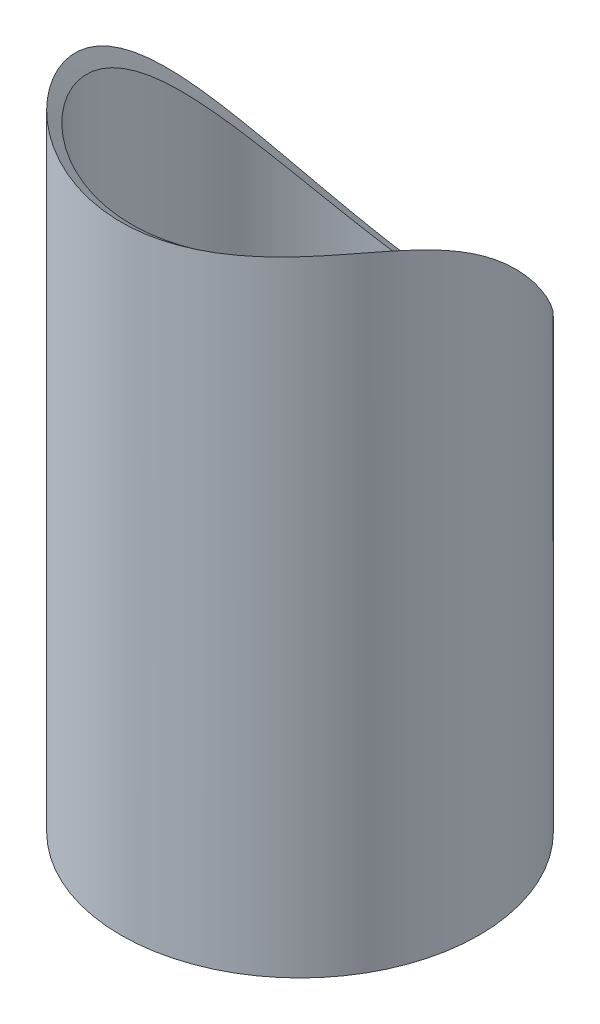
ISO-10303-21;
HEADER;
FILE_DESCRIPTION(('STEP AP214'),'2;1');
FILE_NAME('part.step','',(''),(''),'','','');
FILE_SCHEMA(('AUTOMOTIVE_DESIGN { 1 0 10303 214 1 1 1 1 }'));
ENDSEC;
DATA;
#1=APPLICATION_CONTEXT('core data for automotive mechanical design processes');
#2=APPLICATION_PROTOCOL_DEFINITION('international standard','automotive_design',2000,#1);
#3=PRODUCT_CONTEXT('',#1,'mechanical');
#4=PRODUCT('Part','Part','',(#3));
#5=PRODUCT_RELATED_PRODUCT_CATEGORY('part','',(#4));
#6=PRODUCT_DEFINITION_FORMATION('','',#4);
#7=PRODUCT_DEFINITION_CONTEXT('part definition',#1,'design');
#8=PRODUCT_DEFINITION('design','',#6,#7);
#9=PRODUCT_DEFINITION_SHAPE('','',#8);
#10=(LENGTH_UNIT() NAMED_UNIT(*) SI_UNIT(.MILLI.,.METRE.));
#11=(NAMED_UNIT(*) PLANE_ANGLE_UNIT() SI_UNIT($,.RADIAN.));
#12=(NAMED_UNIT(*) SI_UNIT($,.STERADIAN.) SOLID_ANGLE_UNIT());
#13=UNCERTAINTY_MEASURE_WITH_UNIT(LENGTH_MEASURE(1.E-05),#10,'distance_accuracy_value','');
#14=(GEOMETRIC_REPRESENTATION_CONTEXT(3) GLOBAL_UNCERTAINTY_ASSIGNED_CONTEXT((#13)) GLOBAL_UNIT_ASSIGNED_CONTEXT((#10,
#11,#12)) REPRESENTATION_CONTEXT('',''));
#15=CARTESIAN_POINT('',(0.,0.,0.));
#16=DIRECTION('',(0.,0.,1.));
#17=DIRECTION('',(1.,0.,0.));
#18=AXIS2_PLACEMENT_3D('',#15,#16,#17);
#19=CARTESIAN_POINT('',(0.,0.,0.));
#20=DIRECTION('',(0.,1.,0.));
#21=DIRECTION('',(0.,0.,1.));
#22=AXIS2_PLACEMENT_3D('',#19,#20,#21);
#23=PLANE('',#22);
#24=CARTESIAN_POINT('',(0.,0.,0.));
#25=DIRECTION('',(0.,1.,0.));
#26=DIRECTION('',(0.,0.,1.));
#27=AXIS2_PLACEMENT_3D('',#24,#25,#26);
#28=CIRCLE('',#27,50.);
#29=CARTESIAN_POINT('',(0.,0.,50.0000000000001));
#30=VERTEX_POINT('',#29);
#31=EDGE_CURVE('E57',#30,#30,#28,.T.);
#32=ORIENTED_EDGE('',*,*,#31,.F.);
#33=EDGE_LOOP('',(#32));
#34=FACE_BOUND('',#33,.T.);
#35=CARTESIAN_POINT('',(0.,0.,0.));
#36=DIRECTION('',(0.,1.,0.));
#37=DIRECTION('',(1.,0.,0.));
#38=AXIS2_PLACEMENT_3D('',#35,#36,#37);
#39=CIRCLE('',#38,47.);
#40=CARTESIAN_POINT('',(47.0000000000001,0.,0.));
#41=VERTEX_POINT('',#40);
#42=EDGE_CURVE('E95',#41,#41,#39,.T.);
#43=ORIENTED_EDGE('',*,*,#42,.T.);
#44=EDGE_LOOP('',(#43));
#45=FACE_BOUND('',#44,.T.);
#46=ADVANCED_FACE('F76',(#34,#45),#23,.F.);
#47=CARTESIAN_POINT('',(0.,200.,0.));
#48=DIRECTION('',(0.,-1.,0.));
#49=DIRECTION('',(0.,0.,-1.));
#50=AXIS2_PLACEMENT_3D('',#47,#48,#49);
#51=CYLINDRICAL_SURFACE('',#50,50.);
#52=CARTESIAN_POINT('',(0.,102.326764325178,-50.0000000000001));
#53=CARTESIAN_POINT('',(0.795231155165547,102.32677633696,-49.9999928787591));
#54=CARTESIAN_POINT('',(1.59062664740446,102.357285401247,-49.9809805065112));
#55=CARTESIAN_POINT('',(3.17509377698037,102.478526510149,-49.9053944857018));
#56=CARTESIAN_POINT('',(3.96416372914793,102.569274096255,-49.8488111438596));
#57=CARTESIAN_POINT('',(5.53094144987887,102.808752545755,-49.6993831062527));
#58=CARTESIAN_POINT('',(6.30863396108135,102.957554973607,-49.6064936555319));
#59=CARTESIAN_POINT('',(7.84660876704109,103.309487730468,-49.3865823818624));
#60=CARTESIAN_POINT('',(8.60689011712004,103.512620999763,-49.2595587116304));
#61=CARTESIAN_POINT('',(10.2815428124195,104.02215291929,-48.9405371118884));
#62=CARTESIAN_POINT('',(11.1903846974882,104.341591126601,-48.7402917111025));
#63=CARTESIAN_POINT('',(12.9708214013539,105.047351563788,-48.2970007091835));
#64=CARTESIAN_POINT('',(13.8424065368081,105.43369105166,-48.053944064094));
#65=CARTESIAN_POINT('',(15.5467915762851,106.264684071611,-47.5299198244585));
#66=CARTESIAN_POINT('',(16.3795386988642,106.709413997505,-47.2489025508337));
#67=CARTESIAN_POINT('',(18.0041648696057,107.648305602229,-46.6540309972718));
#68=CARTESIAN_POINT('',(18.7960418735396,108.142469750019,-46.340175077194));
#69=CARTESIAN_POINT('',(20.7677829514783,109.458698303409,-45.501649028043));
#70=CARTESIAN_POINT('',(21.919228276627,110.310607167608,-44.9566058883097));
#71=CARTESIAN_POINT('',(23.5765934213247,111.646779830402,-44.0968453281826));
#72=CARTESIAN_POINT('',(24.1176187572306,112.102084345064,-43.8030988439031));
#73=CARTESIAN_POINT('',(25.177318223479,113.029901569076,-43.2027008942595));
#74=CARTESIAN_POINT('',(25.6959930544053,113.502413738187,-42.8960498339899));
#75=CARTESIAN_POINT('',(27.2218195699025,114.94447192996,-41.957145216769));
#76=CARTESIAN_POINT('',(28.1966260524319,115.936786323278,-41.3070662507145));
#77=CARTESIAN_POINT('',(30.0664148778809,117.967413745257,-39.9666568189324));
#78=CARTESIAN_POINT('',(30.9614058678657,119.005721772765,-39.2763307269387));
#79=CARTESIAN_POINT('',(32.5740142389004,120.989604558241,-37.9458729029163));
#80=CARTESIAN_POINT('',(33.2999797052826,121.931155673256,-37.3098060413672));
#81=CARTESIAN_POINT('',(34.69922714535,123.835759963002,-36.012140657693));
#82=CARTESIAN_POINT('',(35.3725009746669,124.798816432289,-35.3505382121241));
#83=CARTESIAN_POINT('',(36.6699436922086,126.741947232314,-34.0028046544777));
#84=CARTESIAN_POINT('',(37.2940772664785,127.722033194655,-33.3166564087092));
#85=CARTESIAN_POINT('',(38.4953909678007,129.694153525858,-31.9210359536882));
#86=CARTESIAN_POINT('',(39.0725733819641,130.686187310006,-31.2115648829171));
#87=CARTESIAN_POINT('',(40.1830772753761,132.679918021028,-29.7682829433362));
#88=CARTESIAN_POINT('',(40.7163279130805,133.681627753495,-29.0344353402156));
#89=CARTESIAN_POINT('',(41.7396262545141,135.689519614184,-27.5430833603442));
#90=CARTESIAN_POINT('',(42.2296729119428,136.695701850101,-26.7855784112684));
#91=CARTESIAN_POINT('',(43.1674484874484,138.708439461785,-25.2464468894299));
#92=CARTESIAN_POINT('',(43.6151979628074,139.714994415101,-24.4648322820382));
#93=CARTESIAN_POINT('',(44.4692134460975,141.725291651118,-22.8758105816072));
#94=CARTESIAN_POINT('',(44.8754814982419,142.729034070047,-22.0684047621411));
#95=CARTESIAN_POINT('',(45.5446928036897,144.465621442298,-20.6428307366727));
#96=CARTESIAN_POINT('',(45.8171541224691,145.200010398197,-20.0309914857546));
#97=CARTESIAN_POINT('',(46.339336152854,146.663448151003,-18.7914414639263));
#98=CARTESIAN_POINT('',(46.5890575242723,147.392497102288,-18.1637311541998));
#99=CARTESIAN_POINT('',(47.0653454721909,148.843539226763,-16.8912656279326));
#100=CARTESIAN_POINT('',(47.2919073909733,149.565530954338,-16.2465070154086));
#101=CARTESIAN_POINT('',(47.7210962862374,151.000209169178,-14.9388923284498));
#102=CARTESIAN_POINT('',(47.9237232864017,151.712895665651,-14.2760362719225));
#103=CARTESIAN_POINT('',(48.3035237207669,153.124694942434,-12.9327295362779));
#104=CARTESIAN_POINT('',(48.4807634527253,153.823838796169,-12.2523303706063));
#105=CARTESIAN_POINT('',(48.8091000387039,155.207802863047,-10.8708714367499));
#106=CARTESIAN_POINT('',(48.9601960268989,155.892622601145,-10.1698109852071));
#107=CARTESIAN_POINT('',(49.2344703373963,157.244482642277,-8.74598922789924));
#108=CARTESIAN_POINT('',(49.3576614510455,157.911530967333,-8.02323803774285));
#109=CARTESIAN_POINT('',(49.5740759585511,159.224476061468,-6.5545304176125));
#110=CARTESIAN_POINT('',(49.6673030237895,159.870375413135,-5.80857684283274));
#111=CARTESIAN_POINT('',(49.8396341887173,161.288224356092,-4.11123355974497));
#112=CARTESIAN_POINT('',(49.9100583751243,162.053469929062,-3.15330098845998));
#113=CARTESIAN_POINT('',(49.9951932324974,163.536383035215,-1.19879061156345));
#114=CARTESIAN_POINT('',(50.0099092154992,164.254055098341,-0.202216499757603));
#115=CARTESIAN_POINT('',(49.9768777580651,165.631013016188,1.82777261081202));
#116=CARTESIAN_POINT('',(49.9292148120533,166.290376561223,2.8611359342287));
#117=CARTESIAN_POINT('',(49.7642206761808,167.541587434349,4.96311614926866));
#118=CARTESIAN_POINT('',(49.6468911641185,168.133436388003,6.03173219130596));
#119=CARTESIAN_POINT('',(49.4124398271782,168.966932397926,7.66277501663472));
#120=CARTESIAN_POINT('',(49.3237719932608,169.237300708217,8.21483943637373));
#121=CARTESIAN_POINT('',(49.125980334383,169.757298998625,9.32500852954369));
#122=CARTESIAN_POINT('',(49.0168591647474,170.006931664653,9.88311241005818));
#123=CARTESIAN_POINT('',(48.7774489557032,170.484703003667,11.0040439127056));
#124=CARTESIAN_POINT('',(48.6471573591776,170.712839074874,11.5668720976762));
#125=CARTESIAN_POINT('',(48.3648861932602,171.147041609233,12.6955145490505));
#126=CARTESIAN_POINT('',(48.2129095137941,171.353111006768,13.2613284078989));
#127=CARTESIAN_POINT('',(47.8868702660726,171.742993469456,14.394273669452));
#128=CARTESIAN_POINT('',(47.712807337788,171.926806171706,14.9614050934864));
#129=CARTESIAN_POINT('',(47.3424164031711,172.272246267686,16.0950666887334));
#130=CARTESIAN_POINT('',(47.1460911204623,172.433876369945,16.6615969249551));
#131=CARTESIAN_POINT('',(46.7311176956745,172.735390360532,17.7922804314379));
#132=CARTESIAN_POINT('',(46.5124691732735,172.87527387826,18.3564336610314));
#133=CARTESIAN_POINT('',(46.0530183548814,173.133988262764,19.4804599570112));
#134=CARTESIAN_POINT('',(45.8122167572984,173.252819792891,20.0403331577295));
#135=CARTESIAN_POINT('',(45.1319003112059,173.546755458374,21.5451308063664));
#136=CARTESIAN_POINT('',(44.6715447791912,173.702811807283,22.4844879241793));
#137=CARTESIAN_POINT('',(43.6895655333759,173.962608745892,24.3376669192286));
#138=CARTESIAN_POINT('',(43.1679495334114,174.066355913603,25.2514919935257));
#139=CARTESIAN_POINT('',(42.0658145362634,174.228672016122,27.0476998050581));
#140=CARTESIAN_POINT('',(41.4852630613762,174.287215886048,27.9300648396908));
#141=CARTESIAN_POINT('',(40.2685698289489,174.366365033067,29.6573539929146));
#142=CARTESIAN_POINT('',(39.6324231512833,174.386966948762,30.5022747877315));
#143=CARTESIAN_POINT('',(38.2404225425919,174.39794152718,32.2339302399166));
#144=CARTESIAN_POINT('',(37.4789732436936,174.385029417829,33.1161883623898));
#145=CARTESIAN_POINT('',(35.8968445456659,174.330829945527,34.8248843680712));
#146=CARTESIAN_POINT('',(35.0761628752375,174.289541493951,35.6513201083836));
#147=CARTESIAN_POINT('',(33.3796192239417,174.186633412423,37.2445364080527));
#148=CARTESIAN_POINT('',(32.5037423656168,174.125008281742,38.0113007578779));
#149=CARTESIAN_POINT('',(30.7012771460594,173.988537554293,39.4814441190573));
#150=CARTESIAN_POINT('',(29.7746854841053,173.913691096322,40.1848189968684));
#151=CARTESIAN_POINT('',(27.7174840096004,173.743981708956,41.6362511413775));
#152=CARTESIAN_POINT('',(26.5785269064127,173.647857888089,42.3723679939896));
#153=CARTESIAN_POINT('',(24.2446099578016,173.454451367353,43.7496893394174));
#154=CARTESIAN_POINT('',(23.0496447963525,173.357168558134,44.3908847986167));
#155=CARTESIAN_POINT('',(20.6108493553185,173.168351919196,45.574448806399));
#156=CARTESIAN_POINT('',(19.3670053780831,173.076819719957,46.116789408631));
#157=CARTESIAN_POINT('',(16.8386756599534,172.905185539877,47.0988136874802));
#158=CARTESIAN_POINT('',(15.5541901292302,172.825083499938,47.5384978948696));
#159=CARTESIAN_POINT('',(12.9036286498392,172.678031821191,48.3267991100747));
#160=CARTESIAN_POINT('',(11.5363043108704,172.61169429424,48.6713423159362));
#161=CARTESIAN_POINT('',(8.77657624304018,172.499815244604,49.2438601993345));
#162=CARTESIAN_POINT('',(7.38417167584608,172.454274418415,49.4718309728033));
#163=CARTESIAN_POINT('',(4.58463832873363,172.386398094693,49.8093232666276));
#164=CARTESIAN_POINT('',(3.17751092931003,172.364060440851,49.9188557936798));
#165=CARTESIAN_POINT('',(0.358880196481982,172.343732413806,50.0185943329277));
#166=CARTESIAN_POINT('',(-1.05262303552267,172.345741480578,50.0088030898156));
#167=CARTESIAN_POINT('',(-3.84228389314267,172.373727087043,49.8713281888586));
#168=CARTESIAN_POINT('',(-5.22055915882626,172.399240125042,49.7459243925797));
#169=CARTESIAN_POINT('',(-7.96138216213194,172.472311477161,49.3814503482581));
#170=CARTESIAN_POINT('',(-9.32393007826777,172.519869540806,49.1423813916772));
#171=CARTESIAN_POINT('',(-12.0236705153588,172.634601058165,48.5524493259306));
#172=CARTESIAN_POINT('',(-13.3608645677455,172.701773323092,48.2015929919167));
#173=CARTESIAN_POINT('',(-16.0007609696298,172.852114937226,47.3907442836715));
#174=CARTESIAN_POINT('',(-17.3034629976696,172.935284435464,46.9307508927049));
#175=CARTESIAN_POINT('',(-19.8705660999988,173.113138088304,45.902926088806));
#176=CARTESIAN_POINT('',(-21.1348086579538,173.20786347393,45.3347042203529));
#177=CARTESIAN_POINT('',(-22.9920272829026,173.353689911021,44.4054780828261));
#178=CARTESIAN_POINT('',(-23.6046555078712,173.402928638987,44.0828720462419));
#179=CARTESIAN_POINT('',(-24.8159558913726,173.501732597096,43.4125243569897));
#180=CARTESIAN_POINT('',(-25.4146293109076,173.551297797214,43.0647849871885));
#181=CARTESIAN_POINT('',(-26.5975886347781,173.649803471989,42.3444017837804));
#182=CARTESIAN_POINT('',(-27.1818609680714,173.698743337901,41.9717356022974));
#183=CARTESIAN_POINT('',(-28.3344636034067,173.794844685042,41.2024052473812));
#184=CARTESIAN_POINT('',(-28.9027953762306,173.84200633048,40.8057432986885));
#185=CARTESIAN_POINT('',(-30.0226946658046,173.933353792515,39.9889757324013));
#186=CARTESIAN_POINT('',(-30.5742604402669,173.977539300415,39.5688676911151));
#187=CARTESIAN_POINT('',(-31.6595949431079,174.061607629836,38.7059510191568));
#188=CARTESIAN_POINT('',(-32.1933653658236,174.101490861799,38.2631445599));
#189=CARTESIAN_POINT('',(-33.2518961782275,174.176208422139,37.3471583337301));
#190=CARTESIAN_POINT('',(-33.7763106097951,174.21093647062,36.8735698799831));
#191=CARTESIAN_POINT('',(-34.8047817554685,174.272808379176,35.9044059780572));
#192=CARTESIAN_POINT('',(-35.3088406091013,174.299953038107,35.4088328521863));
#193=CARTESIAN_POINT('',(-36.2958160778749,174.344900467194,34.3964186749262));
#194=CARTESIAN_POINT('',(-36.7787277458474,174.36270106199,33.8795727012519));
#195=CARTESIAN_POINT('',(-37.722263419494,174.387053758934,32.8257667806158));
#196=CARTESIAN_POINT('',(-38.1828901259328,174.393607227481,32.2888092850793));
#197=CARTESIAN_POINT('',(-39.0803226919571,174.393457837485,31.1965901867506));
#198=CARTESIAN_POINT('',(-39.5171610575036,174.386773559976,30.6413553145509));
#199=CARTESIAN_POINT('',(-40.366692512381,174.358087220851,29.5131951270633));
#200=CARTESIAN_POINT('',(-40.7793888000701,174.33608719328,28.9402721705386));
#201=CARTESIAN_POINT('',(-41.5796612544318,174.274609458222,27.7782157693444));
#202=CARTESIAN_POINT('',(-41.9672432163685,174.235135799452,27.1890861094775));
#203=CARTESIAN_POINT('',(-42.7164205646865,174.136540845563,25.9962228450816));
#204=CARTESIAN_POINT('',(-43.0780180015605,174.077421102832,25.3924903979251));
#205=CARTESIAN_POINT('',(-43.9522494819807,173.90160292504,23.8605359325979));
#206=CARTESIAN_POINT('',(-44.4477462534691,173.77091784817,22.9240081605286));
#207=CARTESIAN_POINT('',(-45.374858801486,173.452995311705,21.0293719268922));
#208=CARTESIAN_POINT('',(-45.8064857755141,173.265767782542,20.0712672821476));
#209=CARTESIAN_POINT('',(-46.6038022344418,172.829624860387,18.1431105362585));
#210=CARTESIAN_POINT('',(-46.9695730483401,172.580786468783,17.1730747739823));
#211=CARTESIAN_POINT('',(-47.6353387402114,172.018088005333,15.2292502272579));
#212=CARTESIAN_POINT('',(-47.9353321218687,171.704226454645,14.255461357946));
#213=CARTESIAN_POINT('',(-48.4704217217579,171.011093365382,12.3138936561125));
#214=CARTESIAN_POINT('',(-48.7055458285062,170.631850049953,11.3461124162716));
#215=CARTESIAN_POINT('',(-49.1135740969927,169.81004094153,9.42453458847521));
#216=CARTESIAN_POINT('',(-49.2864788233127,169.367475723171,8.47073787369876));
#217=CARTESIAN_POINT('',(-49.573942522184,168.423089179288,6.58306870710715));
#218=CARTESIAN_POINT('',(-49.6884526260244,167.921218654086,5.64921356787106));
#219=CARTESIAN_POINT('',(-49.8634636212367,166.86439579225,3.80678831466837));
#220=CARTESIAN_POINT('',(-49.9239571104165,166.309436192061,2.8982216826467));
#221=CARTESIAN_POINT('',(-49.98677750252,165.29717322138,1.33199084717485));
#222=CARTESIAN_POINT('',(-49.9998346462937,164.849945049938,0.668165427963807));
#223=CARTESIAN_POINT('',(-50.0001622473646,163.932128207913,-0.643240073326549));
#224=CARTESIAN_POINT('',(-49.9874297122739,163.461536832668,-1.29081826140609));
#225=CARTESIAN_POINT('',(-49.9380204239182,162.499583373847,-2.56980543051292));
#226=CARTESIAN_POINT('',(-49.9013331534714,162.008212255713,-3.20120718277495));
#227=CARTESIAN_POINT('',(-49.8057029587799,161.007461938352,-4.44777639092029));
#228=CARTESIAN_POINT('',(-49.7467606138933,160.498083208224,-5.06294426896816));
#229=CARTESIAN_POINT('',(-49.6078758132233,159.461775079119,-6.27972849487964));
#230=CARTESIAN_POINT('',(-49.5278578943181,158.934788676919,-6.88128753645319));
#231=CARTESIAN_POINT('',(-49.3482489907749,157.867175547263,-8.06914681336612));
#232=CARTESIAN_POINT('',(-49.2486580693051,157.326548863833,-8.65544709794332));
#233=CARTESIAN_POINT('',(-49.0310520534146,156.233652718399,-9.81340717667192));
#234=CARTESIAN_POINT('',(-48.9130397034549,155.681385001283,-10.3850691369261));
#235=CARTESIAN_POINT('',(-48.6595223074266,154.566819285827,-11.5145916508858));
#236=CARTESIAN_POINT('',(-48.5240162163466,154.00452069001,-12.0724513777228));
#237=CARTESIAN_POINT('',(-48.1231372608155,152.425720033898,-13.60885183241));
#238=CARTESIAN_POINT('',(-47.8394601436417,151.399888766341,-14.5730975994245));
#239=CARTESIAN_POINT('',(-47.2221365200103,149.328590133262,-16.4638616548736));
#240=CARTESIAN_POINT('',(-46.8884819257695,148.283119613542,-17.3903738060084));
#241=CARTESIAN_POINT('',(-46.1729559179919,146.177990311412,-19.2097462339311));
#242=CARTESIAN_POINT('',(-45.7910466632967,145.118320983767,-20.1025793783501));
#243=CARTESIAN_POINT('',(-44.9802290442567,142.99099231313,-21.8566330361099));
#244=CARTESIAN_POINT('',(-44.5513233405235,141.923333425636,-22.7178553353551));
#245=CARTESIAN_POINT('',(-43.6467451663616,139.785056620734,-24.4106998281441));
#246=CARTESIAN_POINT('',(-43.1710890607193,138.714439865356,-25.242332241647));
#247=CARTESIAN_POINT('',(-42.172182067216,136.574224274878,-26.877971606135));
#248=CARTESIAN_POINT('',(-41.6489293555677,135.504625480372,-27.6819774969107));
#249=CARTESIAN_POINT('',(-40.5538371840858,133.371537319219,-29.2627779568747));
#250=CARTESIAN_POINT('',(-39.9820317100248,132.308044226421,-30.0395910311825));
#251=CARTESIAN_POINT('',(-38.7874932663433,130.190900242364,-31.5669178374915));
#252=CARTESIAN_POINT('',(-38.1647654072002,129.137248375254,-32.3174341978102));
#253=CARTESIAN_POINT('',(-37.1282304602445,127.467568476189,-33.4938332007558));
#254=CARTESIAN_POINT('',(-36.7317239054006,126.846805187669,-33.9283089734325));
#255=CARTESIAN_POINT('',(-35.9189533366179,125.611586953204,-34.787621466831));
#256=CARTESIAN_POINT('',(-35.5026900626861,124.99713177203,-35.2124585476999));
#257=CARTESIAN_POINT('',(-34.6495810521913,123.775675600363,-36.0522512141031));
#258=CARTESIAN_POINT('',(-34.2127333273996,123.1686753371,-36.4672058392509));
#259=CARTESIAN_POINT('',(-33.3176199822008,121.963531263882,-37.2867864722234));
#260=CARTESIAN_POINT('',(-32.8593542600833,121.365387496003,-37.6914124309849));
#261=CARTESIAN_POINT('',(-31.9211903416042,120.180398631533,-38.4891693601176));
#262=CARTESIAN_POINT('',(-31.4413272373452,119.593537270581,-38.8823173800537));
#263=CARTESIAN_POINT('',(-30.4582624410577,118.431836329354,-39.6571045534335));
#264=CARTESIAN_POINT('',(-29.9550603171393,117.856996971833,-40.0387434936852));
#265=CARTESIAN_POINT('',(-28.924358556779,116.721434824388,-40.7895562106594));
#266=CARTESIAN_POINT('',(-28.3968656901363,116.160708167847,-41.1587334113375));
#267=CARTESIAN_POINT('',(-27.3163521672273,115.055486686675,-41.8836494782841));
#268=CARTESIAN_POINT('',(-26.7633333801391,114.510990678319,-42.2393893250676));
#269=CARTESIAN_POINT('',(-25.4148423793767,113.236930001679,-43.0688883121915));
#270=CARTESIAN_POINT('',(-24.6072123992593,112.515816971234,-43.5360243871797));
#271=CARTESIAN_POINT('',(-22.9377948318521,111.117194641079,-44.4382462116946));
#272=CARTESIAN_POINT('',(-22.0760051378585,110.439687039609,-44.8733307130478));
#273=CARTESIAN_POINT('',(-20.2964474090199,109.138659952919,-45.7057798253795));
#274=CARTESIAN_POINT('',(-19.378731984444,108.515091023262,-46.1031790145738));
#275=CARTESIAN_POINT('',(-17.4851643310513,107.33315690987,-46.854086161689));
#276=CARTESIAN_POINT('',(-16.5093341189616,106.774767267372,-47.2076105869422));
#277=CARTESIAN_POINT('',(-14.7741077037759,105.878516286701,-47.7735945303338));
#278=CARTESIAN_POINT('',(-14.0282729115991,105.522045697428,-47.9982300325357));
#279=CARTESIAN_POINT('',(-12.5071753215116,104.85666613146,-48.4168620800481));
#280=CARTESIAN_POINT('',(-11.7319130097551,104.547756369467,-48.6108591312447));
#281=CARTESIAN_POINT('',(-10.1560188616791,103.984178599971,-48.9643346478429));
#282=CARTESIAN_POINT('',(-9.35544144486637,103.729402266588,-49.1238820606676));
#283=CARTESIAN_POINT('',(-7.73138938111397,103.279253136121,-49.4055054990377));
#284=CARTESIAN_POINT('',(-6.90792335706151,103.083858290469,-49.527595432846));
#285=CARTESIAN_POINT('',(-5.57815954723944,102.823134493333,-49.6904005743257));
#286=CARTESIAN_POINT('',(-5.07740644515955,102.737093362188,-49.7440996153112));
#287=CARTESIAN_POINT('',(-4.07102878410686,102.588914175645,-49.8365517829117));
#288=CARTESIAN_POINT('',(-3.56540485018245,102.526773094082,-49.8753068017033));
#289=CARTESIAN_POINT('',(-2.55064599876585,102.427052581275,-49.9374875788808));
#290=CARTESIAN_POINT('',(-2.0415101066305,102.389480270344,-49.9609088933838));
#291=CARTESIAN_POINT('',(-1.02160531716856,102.339333366434,-49.9921667165177));
#292=CARTESIAN_POINT('',(-0.510836565066337,102.326756609111,-50.0000045745069));
#293=CARTESIAN_POINT('',(0.,102.326764325178,-50.0000000000001));
#294=B_SPLINE_CURVE_WITH_KNOTS('',3,(#52,#53,#54,#55,#56,#57,#58,#59,#60,#61,#62,#63,#64,#65,
#66,#67,#68,#69,#70,#71,#72,#73,#74,#75,#76,#77,#78,#79,#80,#81,#82,#83,#84,#85,#86,#87,#88,#89,
#90,#91,#92,#93,#94,#95,#96,#97,#98,#99,#100,#101,#102,#103,#104,#105,#106,#107,#108,#109,#110,
#111,#112,#113,#114,#115,#116,#117,#118,#119,#120,#121,#122,#123,#124,#125,#126,#127,#128,#129,
#130,#131,#132,#133,#134,#135,#136,#137,#138,#139,#140,#141,#142,#143,#144,#145,#146,#147,#148,
#149,#150,#151,#152,#153,#154,#155,#156,#157,#158,#159,#160,#161,#162,#163,#164,#165,#166,#167,
#168,#169,#170,#171,#172,#173,#174,#175,#176,#177,#178,#179,#180,#181,#182,#183,#184,#185,#186,
#187,#188,#189,#190,#191,#192,#193,#194,#195,#196,#197,#198,#199,#200,#201,#202,#203,#204,#205,
#206,#207,#208,#209,#210,#211,#212,#213,#214,#215,#216,#217,#218,#219,#220,#221,#222,#223,#224,
#225,#226,#227,#228,#229,#230,#231,#232,#233,#234,#235,#236,#237,#238,#239,#240,#241,#242,#243,
#244,#245,#246,#247,#248,#249,#250,#251,#252,#253,#254,#255,#256,#257,#258,#259,#260,#261,#262,
#263,#264,#265,#266,#267,#268,#269,#270,#271,#272,#273,#274,#275,#276,#277,#278,#279,#280,#281,
#282,#283,#284,#285,#286,#287,#288,#289,#290,#291,#292,#293),.UNSPECIFIED.,.T.,.F.,(4,2,2,2,2,2,
2,2,2,2,2,2,2,2,2,2,2,2,2,2,2,2,2,2,2,2,2,2,2,2,2,2,2,2,2,2,2,2,2,2,2,2,2,2,2,2,2,2,2,2,2,2,2,2,
2,2,2,2,2,2,2,2,2,2,2,2,2,2,2,2,2,2,2,2,2,2,2,2,2,2,2,2,2,2,2,2,2,2,2,2,2,2,2,2,2,2,2,2,2,2,2,2,
2,2,2,2,2,2,2,2,2,2,2,2,2,2,2,2,2,2,4),(0.,2.385176745267,4.77096910349289,7.15971177824463,
9.54858375353366,12.4959368401175,15.4440513677781,18.396062162927,21.3482204680009,
25.9378259433407,28.2344818925331,30.5310657998622,35.133185024043,39.734805055766,
43.7783976177814,47.8226139548896,51.8697105757607,55.9166099340021,59.9699122857253,
64.0233127720963,68.0747329778494,72.1259534323048,75.1074000424644,78.0887601166179,
81.0707186127504,84.0526741583326,87.0266946462897,90.0008136086141,92.9735664898199,
95.9459549918344,99.6276953811212,103.309084690535,106.985492587704,110.661811948552,
112.524446891445,114.386840187726,116.24945860478,118.111829026004,119.974229809725,
121.836402988737,123.698607898974,125.560754120581,128.729967010606,131.898781264595,
135.069351342433,138.240202297569,141.733286840393,145.226505398765,148.720669589645,
152.215061465711,156.28906866998,160.363463346346,164.43900807707,168.514531735222,
172.744215860831,176.974041631362,181.203474282157,185.432809647481,189.580486984593,
193.728117196982,197.87549607973,202.022913601522,206.185587307117,208.267482772205,
210.349189375287,212.432787996572,214.516193734547,216.599815240667,218.683237790442,
220.80495605091,222.926450719008,225.048439066354,227.170169597607,229.288924092978,
231.407397255722,233.525379815744,235.643195057426,238.842207995796,242.04065942473,
245.235133423875,248.429680083894,251.622851200712,254.815993341804,258.011803360544,
261.208051251418,263.608727704348,266.009682724785,268.411692579444,270.813639907765,
273.224307402002,275.634967116396,278.04526802809,280.455712988936,284.762386724555,
289.069758157458,293.380528629813,297.691055182339,302.000078190524,306.309266379698,
310.615462720662,314.921227428765,317.486506999003,320.051690559943,322.617122398982,
325.182566422062,327.743982749298,330.305446494607,332.86620063336,335.42676755318,
338.962054315287,342.497478678146,346.029627066651,349.560445713436,352.128241657727,
354.695995199471,357.258561006362,359.8201741572,361.352234904962,362.884101603072,
364.416412057378,365.948589824451),.UNSPECIFIED.);
#295=CARTESIAN_POINT('',(0.,102.326764325178,-50.0000000000001));
#296=VERTEX_POINT('',#295);
#297=EDGE_CURVE('E96',#296,#296,#294,.T.);
#298=ORIENTED_EDGE('',*,*,#297,.T.);
#299=EDGE_LOOP('',(#298));
#300=FACE_BOUND('',#299,.T.);
#301=ORIENTED_EDGE('',*,*,#31,.T.);
#302=EDGE_LOOP('',(#301));
#303=FACE_BOUND('',#302,.T.);
#304=ADVANCED_FACE('F85',(#300,#303),#51,.T.);
#305=CARTESIAN_POINT('',(0.,200.,0.));
#306=DIRECTION('',(0.,-1.,0.));
#307=DIRECTION('',(0.,0.,-1.));
#308=AXIS2_PLACEMENT_3D('',#305,#306,#307);
#309=CYLINDRICAL_SURFACE('',#308,47.);
#310=CARTESIAN_POINT('',(0.,104.427386939807,-47.0000000000001));
#311=CARTESIAN_POINT('',(0.764792902859943,104.427392685347,-46.9999965009565));
#312=CARTESIAN_POINT('',(1.52964339276103,104.45639633879,-46.9812902262954));
#313=CARTESIAN_POINT('',(3.05320093226238,104.571635561351,-46.9069280863851));
#314=CARTESIAN_POINT('',(3.81190749873358,104.657875587871,-46.8512693433858));
#315=CARTESIAN_POINT('',(5.31812092431187,104.885422497186,-46.7042894514722));
#316=CARTESIAN_POINT('',(6.06561785253409,105.026775521517,-46.6129384202348));
#317=CARTESIAN_POINT('',(7.54396694678241,105.361101959395,-46.3966266881497));
#318=CARTESIAN_POINT('',(8.27481745911254,105.554080477484,-46.271662663764));
#319=CARTESIAN_POINT('',(9.88369485467062,106.037866373272,-45.957928293162));
#320=CARTESIAN_POINT('',(10.7564525504906,106.340986450916,-45.7610786372378));
#321=CARTESIAN_POINT('',(12.4662664543503,107.010686072943,-45.3251734668508));
#322=CARTESIAN_POINT('',(13.3033139215014,107.377281044423,-45.0861076917956));
#323=CARTESIAN_POINT('',(14.940234047461,108.165845138693,-44.5704704261143));
#324=CARTESIAN_POINT('',(15.7400538391005,108.587889940926,-44.2938476591371));
#325=CARTESIAN_POINT('',(17.3004031237414,109.478909025231,-43.7080171149257));
#326=CARTESIAN_POINT('',(18.060930438666,109.947885904639,-43.3988075342077));
#327=CARTESIAN_POINT('',(19.9460566881046,111.191479882506,-42.5759701102063));
#328=CARTESIAN_POINT('',(21.0439568704176,111.993716570801,-42.0425556591562));
#329=CARTESIAN_POINT('',(22.6243074974842,113.251606160844,-41.2006936030432));
#330=CARTESIAN_POINT('',(23.1401985128735,113.680171972977,-40.91299420979));
#331=CARTESIAN_POINT('',(24.1506468229442,114.553386746644,-40.3247799315056));
#332=CARTESIAN_POINT('',(24.6452047676412,114.998035217381,-40.0242654375043));
#333=CARTESIAN_POINT('',(26.1000096379779,116.354907517845,-39.1038283453312));
#334=CARTESIAN_POINT('',(27.029319416481,117.288391198473,-38.4661254211318));
#335=CARTESIAN_POINT('',(28.8112652229256,119.198126599717,-37.1502028893981));
#336=CARTESIAN_POINT('',(29.6639085279146,120.174374248142,-36.4719871374627));
#337=CARTESIAN_POINT('',(31.1783468392513,122.01358059264,-35.18165902026));
#338=CARTESIAN_POINT('',(31.8497758965268,122.872109000437,-34.5744758361696));
#339=CARTESIAN_POINT('',(33.1443674109587,124.607759160059,-33.3354743609177));
#340=CARTESIAN_POINT('',(33.7675229843574,125.484883541022,-32.7036525755545));
#341=CARTESIAN_POINT('',(34.9685116258367,127.253685221566,-31.4162160015381));
#342=CARTESIAN_POINT('',(35.546314152246,128.145371847674,-30.7605856069746));
#343=CARTESIAN_POINT('',(36.6582986553527,129.938742001813,-29.4265715721833));
#344=CARTESIAN_POINT('',(37.1924825919382,130.840425078611,-28.748188956202));
#345=CARTESIAN_POINT('',(38.2196801311811,132.651497187732,-27.3678133498236));
#346=CARTESIAN_POINT('',(38.7126357715276,133.560895152998,-26.6657890027888));
#347=CARTESIAN_POINT('',(39.657801718316,135.382799253987,-25.2386860225017));
#348=CARTESIAN_POINT('',(40.1100110511485,136.29530546344,-24.5136068389272));
#349=CARTESIAN_POINT('',(40.9742129350447,138.119650679162,-23.0400325666484));
#350=CARTESIAN_POINT('',(41.3862241269943,139.031489798201,-22.2915485460401));
#351=CARTESIAN_POINT('',(42.1704842065015,140.851507322299,-20.7697623079918));
#352=CARTESIAN_POINT('',(42.5427351325707,141.759685912735,-19.9964613655633));
#353=CARTESIAN_POINT('',(43.1575054081512,143.338588691382,-18.6237014837565));
#354=CARTESIAN_POINT('',(43.4089333042018,144.010932027524,-18.0300769160702));
#355=CARTESIAN_POINT('',(43.889122832343,145.34995311302,-16.8274817302065));
#356=CARTESIAN_POINT('',(44.1178851768566,146.016631039845,-16.2185115951257));
#357=CARTESIAN_POINT('',(44.552205070926,147.342674830655,-14.9842942957195));
#358=CARTESIAN_POINT('',(44.75775872917,148.002039451782,-14.3590444233956));
#359=CARTESIAN_POINT('',(45.1447953732143,149.311384620637,-13.0914704327697));
#360=CARTESIAN_POINT('',(45.3262783624974,149.961365169722,-12.4491463169382));
#361=CARTESIAN_POINT('',(45.6636310571111,151.248020613644,-11.1482346192558));
#362=CARTESIAN_POINT('',(45.8195682152736,151.88472654413,-10.4896953270826));
#363=CARTESIAN_POINT('',(46.1050477699275,153.144195855815,-9.15375080579962));
#364=CARTESIAN_POINT('',(46.2345894046393,153.766958834157,-8.47634503284085));
#365=CARTESIAN_POINT('',(46.4655309749075,154.995517796929,-7.10209140040597));
#366=CARTESIAN_POINT('',(46.5669426136735,155.601320742818,-6.40525175939839));
#367=CARTESIAN_POINT('',(46.7396474281144,156.793048311251,-4.99125010683065));
#368=CARTESIAN_POINT('',(46.8109439605019,157.378975142543,-4.27409036971805));
#369=CARTESIAN_POINT('',(46.9375514278286,158.699559472805,-2.60103940200201));
#370=CARTESIAN_POINT('',(46.9816924625653,159.426249156408,-1.63793491445718));
#371=CARTESIAN_POINT('',(47.0091146424172,160.83200716839,0.323332371703793));
#372=CARTESIAN_POINT('',(46.9924024726618,161.511080719364,1.32149130742498));
#373=CARTESIAN_POINT('',(46.8914632697768,162.811968486558,3.34967074306967));
#374=CARTESIAN_POINT('',(46.8073180236633,163.43385104961,4.37965119379913));
#375=CARTESIAN_POINT('',(46.5646512370937,164.612546063977,6.46817607724186));
#376=CARTESIAN_POINT('',(46.4061311238008,165.169359763628,7.52671996149023));
#377=CARTESIAN_POINT('',(46.1068677028641,165.952859580362,9.13560104399427));
#378=CARTESIAN_POINT('',(45.9960647738612,166.206686681376,9.67852426174442));
#379=CARTESIAN_POINT('',(45.7532088855046,166.695046181602,10.7682550206222));
#380=CARTESIAN_POINT('',(45.6211585849127,166.929580989389,11.3150620675795));
#381=CARTESIAN_POINT('',(45.3352328482557,167.378846899069,12.4111862129466));
#382=CARTESIAN_POINT('',(45.1813545430091,167.593575391389,12.960503632131));
#383=CARTESIAN_POINT('',(44.8514037954011,168.002876536226,14.059903951587));
#384=CARTESIAN_POINT('',(44.6753341853732,168.197451755193,14.6099867453265));
#385=CARTESIAN_POINT('',(44.3007103230053,168.566464920599,15.7093718173194));
#386=CARTESIAN_POINT('',(44.1021520755381,168.740899277844,16.2586739392801));
#387=CARTESIAN_POINT('',(43.682526637281,169.069792693572,17.3545702256242));
#388=CARTESIAN_POINT('',(43.4614621016613,169.224254103486,17.9011647014808));
#389=CARTESIAN_POINT('',(42.9968784218998,169.51370355134,18.9899636888321));
#390=CARTESIAN_POINT('',(42.7533590054118,169.648691353042,19.5321681469951));
#391=CARTESIAN_POINT('',(42.2441340452842,169.89989362139,20.6104049529778));
#392=CARTESIAN_POINT('',(41.9784291307717,170.016108620114,21.1464374753285));
#393=CARTESIAN_POINT('',(41.2230388321405,170.309035489841,22.5994973142711));
#394=CARTESIAN_POINT('',(40.7114856107469,170.467949970636,23.5088919204682));
#395=CARTESIAN_POINT('',(39.6255908896088,170.737965645589,25.2963756153959));
#396=CARTESIAN_POINT('',(39.051256510212,170.849072254851,26.1744682393029));
#397=CARTESIAN_POINT('',(37.842672327756,171.030179384511,27.8933013463009));
#398=CARTESIAN_POINT('',(37.2083994716918,171.100164013628,28.7340272734551));
#399=CARTESIAN_POINT('',(35.883660886259,171.205808133949,30.372238999076));
#400=CARTESIAN_POINT('',(35.1931906338095,171.241464859282,31.16972130843));
#401=CARTESIAN_POINT('',(33.6982367582638,171.287021421322,32.7832254859124));
#402=CARTESIAN_POINT('',(32.8890538866014,171.294448077693,33.594964496438));
#403=CARTESIAN_POINT('',(31.2136626722372,171.284733498374,35.1570662357067));
#404=CARTESIAN_POINT('',(30.3474524205991,171.267591439872,35.9074269079821));
#405=CARTESIAN_POINT('',(28.5626520261964,171.215966259092,37.3428262938722));
#406=CARTESIAN_POINT('',(27.6440485805528,171.18147871518,38.027848298645));
#407=CARTESIAN_POINT('',(25.7595945188753,171.101549461382,39.32879914507));
#408=CARTESIAN_POINT('',(24.7937413586196,171.056107161104,39.9447242602173));
#409=CARTESIAN_POINT('',(22.6961758561978,170.953795588432,41.1769635937964));
#410=CARTESIAN_POINT('',(21.5588386327343,170.896207968438,41.783670052583));
#411=CARTESIAN_POINT('',(19.2381399650142,170.780891387106,42.9016683321019));
#412=CARTESIAN_POINT('',(18.0547750539911,170.72316241543,43.4129529488602));
#413=CARTESIAN_POINT('',(15.6495867152172,170.613002318301,44.3367820809419));
#414=CARTESIAN_POINT('',(14.4277558741367,170.560572222371,44.7493074294768));
#415=CARTESIAN_POINT('',(11.95399588489,170.465314121003,45.4726587102874));
#416=CARTESIAN_POINT('',(10.702066938756,170.422486051132,45.7834853250072));
#417=CARTESIAN_POINT('',(8.14458341892098,170.348685752443,46.307799961075));
#418=CARTESIAN_POINT('',(6.83847321075925,170.318040523684,46.5186293144084));
#419=CARTESIAN_POINT('',(4.21283153706305,170.272419898178,46.8294754514244));
#420=CARTESIAN_POINT('',(2.89329975963491,170.257444866423,46.929489653993));
#421=CARTESIAN_POINT('',(0.25049520727098,170.244217870285,47.0179241114492));
#422=CARTESIAN_POINT('',(-1.07277733474594,170.245964886675,47.0063511677058));
#423=CARTESIAN_POINT('',(-3.71349493180928,170.266058600342,46.8717165467007));
#424=CARTESIAN_POINT('',(-5.03094005890814,170.284405091796,46.7486562518061));
#425=CARTESIAN_POINT('',(-7.63663896327127,170.336124797444,46.39388309069));
#426=CARTESIAN_POINT('',(-8.92505407202246,170.369337463302,46.1633300212513));
#427=CARTESIAN_POINT('',(-11.4777958933981,170.44834362594,45.5957224656188));
#428=CARTESIAN_POINT('',(-12.7421227276429,170.494137059182,45.2586685172931));
#429=CARTESIAN_POINT('',(-15.2380772186748,170.594758413651,44.4804445326069));
#430=CARTESIAN_POINT('',(-16.469701843909,170.649587169096,44.0392648808371));
#431=CARTESIAN_POINT('',(-18.8917024188293,170.763525410824,43.0559191913866));
#432=CARTESIAN_POINT('',(-20.0820779129254,170.822634944366,42.5137520387363));
#433=CARTESIAN_POINT('',(-22.4231307707345,170.939630963588,41.3272125017861));
#434=CARTESIAN_POINT('',(-23.5734112106347,170.997503765359,40.6820521584709));
#435=CARTESIAN_POINT('',(-25.2551203249155,171.077353013212,39.6435813794351));
#436=CARTESIAN_POINT('',(-25.8084812867702,171.102812600633,39.2855794429374));
#437=CARTESIAN_POINT('',(-26.8997471969061,171.150323686413,38.5465646245941));
#438=CARTESIAN_POINT('',(-27.4376536508627,171.1723755177,38.1655539956961));
#439=CARTESIAN_POINT('',(-28.4974122817231,171.211924877704,37.3809111722657));
#440=CARTESIAN_POINT('',(-29.0192537503372,171.229419424295,36.9772643742871));
#441=CARTESIAN_POINT('',(-30.0455349134298,171.258572615289,36.148317607081));
#442=CARTESIAN_POINT('',(-30.5499763887739,171.270231858587,35.7230198648955));
#443=CARTESIAN_POINT('',(-31.5406294253881,171.286364974325,34.8514561844228));
#444=CARTESIAN_POINT('',(-32.0268390113057,171.29083807036,34.405187985805));
#445=CARTESIAN_POINT('',(-32.9799895829193,171.291152889864,33.4926193140524));
#446=CARTESIAN_POINT('',(-33.4469327127564,171.286995576459,33.0263210818895));
#447=CARTESIAN_POINT('',(-34.3569499692428,171.268601050504,32.0784677002561));
#448=CARTESIAN_POINT('',(-34.8001879248537,171.254446460195,31.5970683065869));
#449=CARTESIAN_POINT('',(-35.6659096910308,171.214591847576,30.6165080799011));
#450=CARTESIAN_POINT('',(-36.0883959979466,171.188893217765,30.1173493957824));
#451=CARTESIAN_POINT('',(-36.9118536893692,171.12433821442,29.1022718930859));
#452=CARTESIAN_POINT('',(-37.312821739357,171.085479808397,28.5863504966919));
#453=CARTESIAN_POINT('',(-38.0922627632682,170.992978596217,27.5391626961735));
#454=CARTESIAN_POINT('',(-38.4707386712034,170.939337723544,27.007898306977));
#455=CARTESIAN_POINT('',(-39.2038032532522,170.815751516852,25.9323088904151));
#456=CARTESIAN_POINT('',(-39.5584316727357,170.745834223889,25.388007753439));
#457=CARTESIAN_POINT('',(-40.2437023130949,170.588092748097,24.2871310115369));
#458=CARTESIAN_POINT('',(-40.5743478029158,170.500271011938,23.7305570929645));
#459=CARTESIAN_POINT('',(-41.2110013615022,170.305264756785,22.606864739259));
#460=CARTESIAN_POINT('',(-41.5170115395978,170.198081898087,22.0397472120222));
#461=CARTESIAN_POINT('',(-42.1038554013729,169.963050796378,20.8968410553719));
#462=CARTESIAN_POINT('',(-42.3846900237279,169.835203324349,20.3210527501858));
#463=CARTESIAN_POINT('',(-42.8885518574945,169.574443149002,19.2324563882754));
#464=CARTESIAN_POINT('',(-43.1144702340796,169.443985604252,18.7203953742987));
#465=CARTESIAN_POINT('',(-43.5463539536373,169.165668801974,17.6925357231144));
#466=CARTESIAN_POINT('',(-43.7523175630736,169.017808035039,17.1767367653553));
#467=CARTESIAN_POINT('',(-44.144167457894,168.704354203999,16.1430459615988));
#468=CARTESIAN_POINT('',(-44.3300581654052,168.538765061588,15.6251546027525));
#469=CARTESIAN_POINT('',(-44.6819060840278,168.18964009999,14.5885876425637));
#470=CARTESIAN_POINT('',(-44.847861170259,168.00610237149,14.0699119635783));
#471=CARTESIAN_POINT('',(-45.1599950259139,167.621150534108,13.0333318089054));
#472=CARTESIAN_POINT('',(-45.3061768352482,167.419739180991,12.5154272268064));
#473=CARTESIAN_POINT('',(-45.5791364059901,166.999269894491,11.481652535029));
#474=CARTESIAN_POINT('',(-45.7059116275484,166.780209657015,10.9657827002419));
#475=CARTESIAN_POINT('',(-46.0577540316466,166.097101192875,9.42310444689732));
#476=CARTESIAN_POINT('',(-46.2544001508512,165.607047854611,8.40101865866568));
#477=CARTESIAN_POINT('',(-46.5079721720107,164.785171333762,6.80852623726718));
#478=CARTESIAN_POINT('',(-46.5887682054392,164.474538452985,6.23064466280855));
#479=CARTESIAN_POINT('',(-46.727889769941,163.833488164199,5.0831232458202));
#480=CARTESIAN_POINT('',(-46.7862144344718,163.503069993795,4.51348372193606));
#481=CARTESIAN_POINT('',(-46.8814893465315,162.823860970977,3.38343141354574));
#482=CARTESIAN_POINT('',(-46.9184381339582,162.475068865285,2.82301926186463));
#483=CARTESIAN_POINT('',(-46.9720995765082,161.76057604021,1.71205829398218));
#484=CARTESIAN_POINT('',(-46.9888099364543,161.394873407937,1.16151060345258));
#485=CARTESIAN_POINT('',(-47.0102909521199,160.273220546245,-0.476671659186503));
#486=CARTESIAN_POINT('',(-46.9862526680649,159.493923199011,-1.54886577948458));
#487=CARTESIAN_POINT('',(-46.8698446578821,157.884938194466,-3.65046060260236));
#488=CARTESIAN_POINT('',(-46.7774701415172,157.055247008388,-4.67985830013294));
#489=CARTESIAN_POINT('',(-46.5542111840389,155.512494990788,-6.51087816795373));
#490=CARTESIAN_POINT('',(-46.4335781006646,154.806163519101,-7.31948014457782));
#491=CARTESIAN_POINT('',(-46.1547219814198,153.371425110352,-8.91032847869104));
#492=CARTESIAN_POINT('',(-45.9964935281049,152.643015004997,-9.69257101925317));
#493=CARTESIAN_POINT('',(-45.6449012870958,151.168021216444,-11.2324082279723));
#494=CARTESIAN_POINT('',(-45.4515173537308,150.421427326666,-11.9899884685056));
#495=CARTESIAN_POINT('',(-45.0316527211768,148.914164401109,-13.4814844610547));
#496=CARTESIAN_POINT('',(-44.8051733630783,148.15349593675,-14.2154011704922));
#497=CARTESIAN_POINT('',(-44.319794998983,146.618807224917,-15.6633541639794));
#498=CARTESIAN_POINT('',(-44.0607942976691,145.844751966639,-16.3773190997587));
#499=CARTESIAN_POINT('',(-43.5119635964812,144.288540910778,-17.7842393367874));
#500=CARTESIAN_POINT('',(-43.2221333762673,143.506385055335,-18.4771944878337));
#501=CARTESIAN_POINT('',(-42.6123513068716,141.936794079974,-19.8430513260652));
#502=CARTESIAN_POINT('',(-42.2924085357836,141.149360617173,-20.5159589769837));
#503=CARTESIAN_POINT('',(-41.6225827064583,139.571353192361,-21.842915474714));
#504=CARTESIAN_POINT('',(-41.2726995055216,138.780779215397,-22.4969642316221));
#505=CARTESIAN_POINT('',(-40.5125639937809,137.132909810453,-23.8406499230504));
#506=CARTESIAN_POINT('',(-40.0997109547888,136.275535511636,-24.528720524923));
#507=CARTESIAN_POINT('',(-39.2383099020672,134.562483272777,-25.8843576048315));
#508=CARTESIAN_POINT('',(-38.7897613172514,133.7068053601,-26.5519237545838));
#509=CARTESIAN_POINT('',(-37.8559009034723,131.999570304627,-27.8672131631323));
#510=CARTESIAN_POINT('',(-37.3705736441113,131.148015052671,-28.5149279314837));
#511=CARTESIAN_POINT('',(-36.3620784308978,129.452299146283,-29.7902692466914));
#512=CARTESIAN_POINT('',(-35.8389111495424,128.608138360734,-30.4178961502657));
#513=CARTESIAN_POINT('',(-34.7555312805202,126.934070983223,-31.6500078854259));
#514=CARTESIAN_POINT('',(-34.1954948620674,126.104117522288,-32.254583673342));
#515=CARTESIAN_POINT('',(-33.0342940517021,124.45799684053,-33.4428704829483));
#516=CARTESIAN_POINT('',(-32.4331272267653,123.641830438833,-34.0265802672179));
#517=CARTESIAN_POINT('',(-31.1878700943453,122.027920608575,-35.171459447021));
#518=CARTESIAN_POINT('',(-30.5438150559718,121.230162751347,-35.7326467697638));
#519=CARTESIAN_POINT('',(-29.2097956811482,119.65712405438,-36.8311596622324));
#520=CARTESIAN_POINT('',(-28.519840703101,118.881838678792,-37.3684900590512));
#521=CARTESIAN_POINT('',(-27.1606097012327,117.433335009006,-38.3658807741191));
#522=CARTESIAN_POINT('',(-26.4958743253287,116.757534351813,-38.8283674203445));
#523=CARTESIAN_POINT('',(-25.1242248432751,115.433507859408,-39.7296707541949));
#524=CARTESIAN_POINT('',(-24.4173147166018,114.785279432423,-40.1684896676163));
#525=CARTESIAN_POINT('',(-22.9579833231813,113.521342155236,-41.0200633231969));
#526=CARTESIAN_POINT('',(-22.2055049710243,112.905675983822,-41.4327839908801));
#527=CARTESIAN_POINT('',(-20.6536811259754,111.714766853902,-42.2277811943709));
#528=CARTESIAN_POINT('',(-19.8543346099019,111.1395247785,-42.6100570651063));
#529=CARTESIAN_POINT('',(-18.1961470418645,110.030519612077,-43.3443551794763));
#530=CARTESIAN_POINT('',(-17.3366550043804,109.497411588094,-43.6959062601873));
#531=CARTESIAN_POINT('',(-15.5672496343331,108.491587175188,-44.357106519586));
#532=CARTESIAN_POINT('',(-14.6573299529705,108.01887841536,-44.666750405223));
#533=CARTESIAN_POINT('',(-12.7910250326366,107.146916909767,-45.2364632411376));
#534=CARTESIAN_POINT('',(-11.8347864860698,106.747449266096,-45.4966773079544));
#535=CARTESIAN_POINT('',(-10.3678264239607,106.211726713448,-45.844967290228));
#536=CARTESIAN_POINT('',(-9.87346201375632,106.04374728575,-45.9540491088209));
#537=CARTESIAN_POINT('',(-8.87464019431568,105.730409500953,-46.1573435830174));
#538=CARTESIAN_POINT('',(-8.37018422290678,105.585047946844,-46.2515583400895));
#539=CARTESIAN_POINT('',(-7.22578949882118,105.285291917761,-46.4457015529239));
#540=CARTESIAN_POINT('',(-6.58332059399277,105.137621498399,-46.5412368756989));
#541=CARTESIAN_POINT('',(-5.28728931658495,104.882438443944,-46.7062221802116));
#542=CARTESIAN_POINT('',(-4.63372960992558,104.774916297355,-46.7756783403657));
#543=CARTESIAN_POINT('',(-3.31887779040964,104.602032220695,-46.8873134745817));
#544=CARTESIAN_POINT('',(-2.65758771627531,104.5366594191,-46.9294994824049));
#545=CARTESIAN_POINT('',(-1.33087996991399,104.44933152501,-46.9858460450664));
#546=CARTESIAN_POINT('',(-0.665461784797285,104.427381940497,-47.0000030445888));
#547=CARTESIAN_POINT('',(0.,104.427386939807,-47.0000000000001));
#548=B_SPLINE_CURVE_WITH_KNOTS('',3,(#310,#311,#312,#313,#314,#315,#316,#317,#318,#319,#320,
#321,#322,#323,#324,#325,#326,#327,#328,#329,#330,#331,#332,#333,#334,#335,#336,#337,#338,#339,
#340,#341,#342,#343,#344,#345,#346,#347,#348,#349,#350,#351,#352,#353,#354,#355,#356,#357,#358,
#359,#360,#361,#362,#363,#364,#365,#366,#367,#368,#369,#370,#371,#372,#373,#374,#375,#376,#377,
#378,#379,#380,#381,#382,#383,#384,#385,#386,#387,#388,#389,#390,#391,#392,#393,#394,#395,#396,
#397,#398,#399,#400,#401,#402,#403,#404,#405,#406,#407,#408,#409,#410,#411,#412,#413,#414,#415,
#416,#417,#418,#419,#420,#421,#422,#423,#424,#425,#426,#427,#428,#429,#430,#431,#432,#433,#434,
#435,#436,#437,#438,#439,#440,#441,#442,#443,#444,#445,#446,#447,#448,#449,#450,#451,#452,#453,
#454,#455,#456,#457,#458,#459,#460,#461,#462,#463,#464,#465,#466,#467,#468,#469,#470,#471,#472,
#473,#474,#475,#476,#477,#478,#479,#480,#481,#482,#483,#484,#485,#486,#487,#488,#489,#490,#491,
#492,#493,#494,#495,#496,#497,#498,#499,#500,#501,#502,#503,#504,#505,#506,#507,#508,#509,#510,
#511,#512,#513,#514,#515,#516,#517,#518,#519,#520,#521,#522,#523,#524,#525,#526,#527,#528,#529,
#530,#531,#532,#533,#534,#535,#536,#537,#538,#539,#540,#541,#542,#543,#544,#545,#546,#547),
.UNSPECIFIED.,.T.,.F.,(4,2,2,2,2,2,2,2,2,2,2,2,2,2,2,2,2,2,2,2,2,2,2,2,2,2,2,2,2,2,2,2,2,2,2,2,
2,2,2,2,2,2,2,2,2,2,2,2,2,2,2,2,2,2,2,2,2,2,2,2,2,2,2,2,2,2,2,2,2,2,2,2,2,2,2,2,2,2,2,2,2,2,2,2,
2,2,2,2,2,2,2,2,2,2,2,2,2,2,2,2,2,2,2,2,2,2,2,2,2,2,2,2,2,2,2,2,2,2,4),(0.,2.29371040008322,
4.58759944857863,6.88341311796883,9.17945387307579,12.0090934887883,14.8394217950158,
17.673653937187,20.5080430194885,24.8824188145888,27.0713377770897,29.2601899963752,
33.646511057888,38.0324153370077,41.7738940261948,45.5159052686675,49.2604152155789,
53.0047568199644,56.7542770253753,60.5038867996599,64.2517494380418,67.9994198309082,
70.7934741252218,73.5874405690223,76.3818747730428,79.1763085727303,81.9632405067018,
84.750252860655,87.536103960301,90.321644459323,93.94083229836,97.5596225575359,
101.174030354159,104.788368797525,106.616247980244,108.44389861133,110.271789700884,
112.099447727779,113.927430950605,115.755198767207,117.582988754982,119.410726928643,
122.573201566913,125.735317903395,128.898655413619,132.062247779205,135.497350537479,
138.932568341017,142.368662279337,145.804941442661,149.671483510336,153.538317368763,
157.405901078977,161.273458835439,165.238764703071,169.204162928931,173.16931946059,
177.134426827691,181.05770889735,184.980971153325,188.904595841832,192.828263852347,
196.783531690998,198.761735264312,200.739745450495,202.719046743597,204.698144853161,
206.677456774158,208.656547822446,210.619471263404,212.582157990417,214.545147986848,
216.507881354292,218.467258021876,220.426367116722,222.385308289489,224.344176392348,
226.067633838385,227.791240872836,229.514467412885,231.237877464008,232.961022259068,
234.684392379314,238.130442004052,240.112958570932,242.095551580101,244.078279996423,
246.061233246773,250.034076134101,254.007197536384,257.247178162926,260.487625949947,
263.729936546471,266.972115794728,270.224698450623,273.477304354414,276.728932810116,
279.980576764301,283.502748019728,287.024975637035,290.54868926536,294.072340285231,
297.580230168672,301.088327737222,304.59357522292,308.098110211504,311.261015789658,
314.423623396593,317.590278370699,320.757002501999,323.965935612693,327.175273647322,
330.375038911955,331.974570864754,333.57387651978,335.570415605575,337.566481392257,
339.562032130172,341.557835975814),.UNSPECIFIED.);
#549=CARTESIAN_POINT('',(0.,104.427386939807,-47.0000000000001));
#550=VERTEX_POINT('',#549);
#551=EDGE_CURVE('E83',#550,#550,#548,.T.);
#552=ORIENTED_EDGE('',*,*,#551,.F.);
#553=EDGE_LOOP('',(#552));
#554=FACE_BOUND('',#553,.T.);
#555=ORIENTED_EDGE('',*,*,#42,.F.);
#556=EDGE_LOOP('',(#555));
#557=FACE_BOUND('',#556,.T.);
#558=ADVANCED_FACE('F106',(#554,#557),#309,.F.);
#559=CARTESIAN_POINT('',(0.,236.737669159099,24.2760071185446));
#560=DIRECTION('',(0.,-0.573576436351044,-0.819152044288995));
#561=DIRECTION('',(0.,0.819152044288993,-0.573576436351045));
#562=AXIS2_PLACEMENT_3D('',#559,#560,#561);
#563=CYLINDRICAL_SURFACE('',#562,67.5);
#564=ORIENTED_EDGE('',*,*,#551,.T.);
#565=EDGE_LOOP('',(#564));
#566=FACE_BOUND('',#565,.T.);
#567=ORIENTED_EDGE('',*,*,#297,.F.);
#568=EDGE_LOOP('',(#567));
#569=FACE_BOUND('',#568,.T.);
#570=ADVANCED_FACE('F101',(#566,#569),#563,.F.);
#571=CLOSED_SHELL('',(#46,#304,#558,#570));
#572=MANIFOLD_SOLID_BREP('B7',#571);
#573=ADVANCED_BREP_SHAPE_REPRESENTATION('',(#18,#572),#14);
#574=SHAPE_DEFINITION_REPRESENTATION(#9,#573);
ENDSEC;
END-ISO-10303-21;
